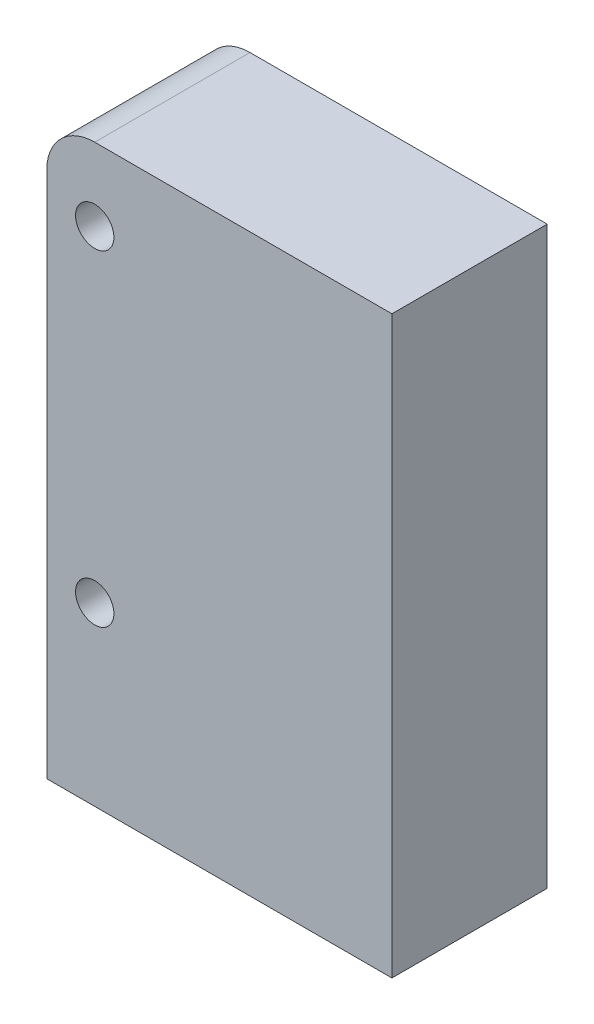
ISO-10303-21;
HEADER;
FILE_DESCRIPTION(('STEP AP214'),'2;1');
FILE_NAME('part.step','',(''),(''),'','','');
FILE_SCHEMA(('AUTOMOTIVE_DESIGN { 1 0 10303 214 1 1 1 1 }'));
ENDSEC;
DATA;
#1=APPLICATION_CONTEXT('core data for automotive mechanical design processes');
#2=APPLICATION_PROTOCOL_DEFINITION('international standard','automotive_design',2000,#1);
#3=PRODUCT_CONTEXT('',#1,'mechanical');
#4=PRODUCT('Part','Part','',(#3));
#5=PRODUCT_RELATED_PRODUCT_CATEGORY('part','',(#4));
#6=PRODUCT_DEFINITION_FORMATION('','',#4);
#7=PRODUCT_DEFINITION_CONTEXT('part definition',#1,'design');
#8=PRODUCT_DEFINITION('design','',#6,#7);
#9=PRODUCT_DEFINITION_SHAPE('','',#8);
#10=(LENGTH_UNIT() NAMED_UNIT(*) SI_UNIT(.MILLI.,.METRE.));
#11=(NAMED_UNIT(*) PLANE_ANGLE_UNIT() SI_UNIT($,.RADIAN.));
#12=(NAMED_UNIT(*) SI_UNIT($,.STERADIAN.) SOLID_ANGLE_UNIT());
#13=UNCERTAINTY_MEASURE_WITH_UNIT(LENGTH_MEASURE(1.E-05),#10,'distance_accuracy_value','');
#14=(GEOMETRIC_REPRESENTATION_CONTEXT(3) GLOBAL_UNCERTAINTY_ASSIGNED_CONTEXT((#13)) GLOBAL_UNIT_ASSIGNED_CONTEXT((#10,
#11,#12)) REPRESENTATION_CONTEXT('',''));
#15=CARTESIAN_POINT('',(0.,0.,0.));
#16=DIRECTION('',(0.,0.,1.));
#17=DIRECTION('',(1.,0.,0.));
#18=AXIS2_PLACEMENT_3D('',#15,#16,#17);
#19=CARTESIAN_POINT('',(0.,0.,8.1));
#20=DIRECTION('',(1.,0.,0.));
#21=DIRECTION('',(0.,0.,-1.));
#22=AXIS2_PLACEMENT_3D('',#19,#20,#21);
#23=PLANE('',#22);
#24=DIRECTION('',(0.,-1.,0.));
#25=VECTOR('',#24,1.);
#26=CARTESIAN_POINT('',(0.,0.,8.1));
#27=LINE('',#26,#25);
#28=CARTESIAN_POINT('',(0.,27.5,8.1));
#29=VERTEX_POINT('',#28);
#30=CARTESIAN_POINT('',(0.,0.,8.1));
#31=VERTEX_POINT('',#30);
#32=EDGE_CURVE('E79',#29,#31,#27,.T.);
#33=ORIENTED_EDGE('',*,*,#32,.F.);
#34=DIRECTION('',(0.,0.,-1.));
#35=VECTOR('',#34,1.);
#36=CARTESIAN_POINT('',(0.,27.5,8.1));
#37=LINE('',#36,#35);
#38=CARTESIAN_POINT('',(0.,27.5,0.));
#39=VERTEX_POINT('',#38);
#40=EDGE_CURVE('E102',#29,#39,#37,.T.);
#41=ORIENTED_EDGE('',*,*,#40,.T.);
#42=DIRECTION('',(0.,-1.,0.));
#43=VECTOR('',#42,1.);
#44=CARTESIAN_POINT('',(0.,0.,0.));
#45=LINE('',#44,#43);
#46=CARTESIAN_POINT('',(0.,0.,0.));
#47=VERTEX_POINT('',#46);
#48=EDGE_CURVE('E100',#39,#47,#45,.T.);
#49=ORIENTED_EDGE('',*,*,#48,.T.);
#50=DIRECTION('',(0.,0.,-1.));
#51=VECTOR('',#50,1.);
#52=CARTESIAN_POINT('',(0.,0.,8.1));
#53=LINE('',#52,#51);
#54=EDGE_CURVE('E94',#31,#47,#53,.T.);
#55=ORIENTED_EDGE('',*,*,#54,.F.);
#56=EDGE_LOOP('',(#33,#41,#49,#55));
#57=FACE_BOUND('',#56,.T.);
#58=ADVANCED_FACE('F33',(#57),#23,.F.);
#59=CARTESIAN_POINT('',(0.,0.,8.1));
#60=DIRECTION('',(0.,1.,0.));
#61=DIRECTION('',(0.,0.,1.));
#62=AXIS2_PLACEMENT_3D('',#59,#60,#61);
#63=PLANE('',#62);
#64=DIRECTION('',(1.,0.,0.));
#65=VECTOR('',#64,1.);
#66=CARTESIAN_POINT('',(0.,0.,0.));
#67=LINE('',#66,#65);
#68=CARTESIAN_POINT('',(18.,0.,0.));
#69=VERTEX_POINT('',#68);
#70=EDGE_CURVE('E115',#47,#69,#67,.T.);
#71=ORIENTED_EDGE('',*,*,#70,.T.);
#72=DIRECTION('',(0.,0.,-1.));
#73=VECTOR('',#72,1.);
#74=CARTESIAN_POINT('',(18.,0.,8.1));
#75=LINE('',#74,#73);
#76=CARTESIAN_POINT('',(18.,0.,8.1));
#77=VERTEX_POINT('',#76);
#78=EDGE_CURVE('E96',#77,#69,#75,.T.);
#79=ORIENTED_EDGE('',*,*,#78,.F.);
#80=DIRECTION('',(1.,0.,0.));
#81=VECTOR('',#80,1.);
#82=CARTESIAN_POINT('',(0.,0.,8.1));
#83=LINE('',#82,#81);
#84=EDGE_CURVE('E82',#31,#77,#83,.T.);
#85=ORIENTED_EDGE('',*,*,#84,.F.);
#86=ORIENTED_EDGE('',*,*,#54,.T.);
#87=EDGE_LOOP('',(#71,#79,#85,#86));
#88=FACE_BOUND('',#87,.T.);
#89=ADVANCED_FACE('F93',(#88),#63,.F.);
#90=CARTESIAN_POINT('',(18.,0.,8.1));
#91=DIRECTION('',(-1.,0.,0.));
#92=DIRECTION('',(0.,0.,1.));
#93=AXIS2_PLACEMENT_3D('',#90,#91,#92);
#94=PLANE('',#93);
#95=DIRECTION('',(0.,1.,0.));
#96=VECTOR('',#95,1.);
#97=CARTESIAN_POINT('',(18.,0.,0.));
#98=LINE('',#97,#96);
#99=CARTESIAN_POINT('',(18.,30.,0.));
#100=VERTEX_POINT('',#99);
#101=EDGE_CURVE('E113',#69,#100,#98,.T.);
#102=ORIENTED_EDGE('',*,*,#101,.T.);
#103=DIRECTION('',(0.,0.,-1.));
#104=VECTOR('',#103,1.);
#105=CARTESIAN_POINT('',(18.,30.,8.1));
#106=LINE('',#105,#104);
#107=CARTESIAN_POINT('',(18.,30.,8.1));
#108=VERTEX_POINT('',#107);
#109=EDGE_CURVE('E105',#108,#100,#106,.T.);
#110=ORIENTED_EDGE('',*,*,#109,.F.);
#111=DIRECTION('',(0.,1.,0.));
#112=VECTOR('',#111,1.);
#113=CARTESIAN_POINT('',(18.,0.,8.1));
#114=LINE('',#113,#112);
#115=EDGE_CURVE('E98',#77,#108,#114,.T.);
#116=ORIENTED_EDGE('',*,*,#115,.F.);
#117=ORIENTED_EDGE('',*,*,#78,.T.);
#118=EDGE_LOOP('',(#102,#110,#116,#117));
#119=FACE_BOUND('',#118,.T.);
#120=ADVANCED_FACE('F161',(#119),#94,.F.);
#121=CARTESIAN_POINT('',(0.,30.,8.1));
#122=DIRECTION('',(0.,-1.,0.));
#123=DIRECTION('',(0.,0.,-1.));
#124=AXIS2_PLACEMENT_3D('',#121,#122,#123);
#125=PLANE('',#124);
#126=DIRECTION('',(-1.,0.,0.));
#127=VECTOR('',#126,1.);
#128=CARTESIAN_POINT('',(0.,30.,0.));
#129=LINE('',#128,#127);
#130=CARTESIAN_POINT('',(2.5,30.,0.));
#131=VERTEX_POINT('',#130);
#132=EDGE_CURVE('E89',#100,#131,#129,.T.);
#133=ORIENTED_EDGE('',*,*,#132,.T.);
#134=DIRECTION('',(0.,0.,-1.));
#135=VECTOR('',#134,1.);
#136=CARTESIAN_POINT('',(2.5,30.,8.1));
#137=LINE('',#136,#135);
#138=CARTESIAN_POINT('',(2.5,30.,8.1));
#139=VERTEX_POINT('',#138);
#140=EDGE_CURVE('E41',#131,#139,#137,.F.);
#141=ORIENTED_EDGE('',*,*,#140,.T.);
#142=DIRECTION('',(-1.,0.,0.));
#143=VECTOR('',#142,1.);
#144=CARTESIAN_POINT('',(0.,30.,8.1));
#145=LINE('',#144,#143);
#146=EDGE_CURVE('E111',#108,#139,#145,.T.);
#147=ORIENTED_EDGE('',*,*,#146,.F.);
#148=ORIENTED_EDGE('',*,*,#109,.T.);
#149=EDGE_LOOP('',(#133,#141,#147,#148));
#150=FACE_BOUND('',#149,.T.);
#151=ADVANCED_FACE('F145',(#150),#125,.F.);
#152=CARTESIAN_POINT('',(0.,0.,8.1));
#153=DIRECTION('',(0.,0.,-1.));
#154=DIRECTION('',(-1.,0.,0.));
#155=AXIS2_PLACEMENT_3D('',#152,#153,#154);
#156=PLANE('',#155);
#157=CARTESIAN_POINT('',(2.5,9.2,8.1));
#158=DIRECTION('',(0.,0.,1.));
#159=DIRECTION('',(1.,0.,0.));
#160=AXIS2_PLACEMENT_3D('',#157,#158,#159);
#161=CIRCLE('',#160,1.);
#162=CARTESIAN_POINT('',(3.5,9.2,8.1));
#163=VERTEX_POINT('',#162);
#164=EDGE_CURVE('E127',#163,#163,#161,.T.);
#165=ORIENTED_EDGE('',*,*,#164,.F.);
#166=EDGE_LOOP('',(#165));
#167=FACE_BOUND('',#166,.T.);
#168=CARTESIAN_POINT('',(2.5,26.2,8.1));
#169=DIRECTION('',(0.,0.,1.));
#170=DIRECTION('',(1.,0.,0.));
#171=AXIS2_PLACEMENT_3D('',#168,#169,#170);
#172=CIRCLE('',#171,1.);
#173=CARTESIAN_POINT('',(3.5,26.2,8.1));
#174=VERTEX_POINT('',#173);
#175=EDGE_CURVE('E121',#174,#174,#172,.T.);
#176=ORIENTED_EDGE('',*,*,#175,.F.);
#177=EDGE_LOOP('',(#176));
#178=FACE_BOUND('',#177,.T.);
#179=ORIENTED_EDGE('',*,*,#146,.T.);
#180=CARTESIAN_POINT('',(2.5,27.5,8.1));
#181=DIRECTION('',(0.,0.,-1.));
#182=DIRECTION('',(-1.,0.,0.));
#183=AXIS2_PLACEMENT_3D('',#180,#181,#182);
#184=CIRCLE('',#183,2.5);
#185=EDGE_CURVE('E11',#139,#29,#184,.F.);
#186=ORIENTED_EDGE('',*,*,#185,.T.);
#187=ORIENTED_EDGE('',*,*,#32,.T.);
#188=ORIENTED_EDGE('',*,*,#84,.T.);
#189=ORIENTED_EDGE('',*,*,#115,.T.);
#190=EDGE_LOOP('',(#179,#186,#187,#188,#189));
#191=FACE_BOUND('',#190,.T.);
#192=ADVANCED_FACE('F81',(#167,#178,#191),#156,.F.);
#193=CARTESIAN_POINT('',(0.,0.,0.));
#194=DIRECTION('',(0.,0.,-1.));
#195=DIRECTION('',(-1.,0.,0.));
#196=AXIS2_PLACEMENT_3D('',#193,#194,#195);
#197=PLANE('',#196);
#198=CARTESIAN_POINT('',(2.5,9.2,0.));
#199=DIRECTION('',(0.,0.,1.));
#200=DIRECTION('',(1.,0.,0.));
#201=AXIS2_PLACEMENT_3D('',#198,#199,#200);
#202=CIRCLE('',#201,1.);
#203=CARTESIAN_POINT('',(3.5,9.2,0.));
#204=VERTEX_POINT('',#203);
#205=EDGE_CURVE('E124',#204,#204,#202,.T.);
#206=ORIENTED_EDGE('',*,*,#205,.T.);
#207=EDGE_LOOP('',(#206));
#208=FACE_BOUND('',#207,.T.);
#209=CARTESIAN_POINT('',(2.5,26.2,0.));
#210=DIRECTION('',(0.,0.,1.));
#211=DIRECTION('',(1.,0.,0.));
#212=AXIS2_PLACEMENT_3D('',#209,#210,#211);
#213=CIRCLE('',#212,1.);
#214=CARTESIAN_POINT('',(3.5,26.2,0.));
#215=VERTEX_POINT('',#214);
#216=EDGE_CURVE('E118',#215,#215,#213,.T.);
#217=ORIENTED_EDGE('',*,*,#216,.T.);
#218=EDGE_LOOP('',(#217));
#219=FACE_BOUND('',#218,.T.);
#220=ORIENTED_EDGE('',*,*,#48,.F.);
#221=CARTESIAN_POINT('',(2.5,27.5,0.));
#222=DIRECTION('',(0.,0.,-1.));
#223=DIRECTION('',(-1.,0.,0.));
#224=AXIS2_PLACEMENT_3D('',#221,#222,#223);
#225=CIRCLE('',#224,2.5);
#226=EDGE_CURVE('E55',#39,#131,#225,.T.);
#227=ORIENTED_EDGE('',*,*,#226,.T.);
#228=ORIENTED_EDGE('',*,*,#132,.F.);
#229=ORIENTED_EDGE('',*,*,#101,.F.);
#230=ORIENTED_EDGE('',*,*,#70,.F.);
#231=EDGE_LOOP('',(#220,#227,#228,#229,#230));
#232=FACE_BOUND('',#231,.T.);
#233=ADVANCED_FACE('F133',(#208,#219,#232),#197,.T.);
#234=CARTESIAN_POINT('',(2.5,26.2,0.));
#235=DIRECTION('',(0.,0.,1.));
#236=DIRECTION('',(1.,0.,0.));
#237=AXIS2_PLACEMENT_3D('',#234,#235,#236);
#238=CYLINDRICAL_SURFACE('',#237,1.);
#239=ORIENTED_EDGE('',*,*,#216,.F.);
#240=EDGE_LOOP('',(#239));
#241=FACE_BOUND('',#240,.T.);
#242=ORIENTED_EDGE('',*,*,#175,.T.);
#243=EDGE_LOOP('',(#242));
#244=FACE_BOUND('',#243,.T.);
#245=ADVANCED_FACE('F139',(#241,#244),#238,.F.);
#246=CARTESIAN_POINT('',(2.5,9.2,0.));
#247=DIRECTION('',(0.,0.,1.));
#248=DIRECTION('',(1.,0.,0.));
#249=AXIS2_PLACEMENT_3D('',#246,#247,#248);
#250=CYLINDRICAL_SURFACE('',#249,1.);
#251=ORIENTED_EDGE('',*,*,#205,.F.);
#252=EDGE_LOOP('',(#251));
#253=FACE_BOUND('',#252,.T.);
#254=ORIENTED_EDGE('',*,*,#164,.T.);
#255=EDGE_LOOP('',(#254));
#256=FACE_BOUND('',#255,.T.);
#257=ADVANCED_FACE('F136',(#253,#256),#250,.F.);
#258=CARTESIAN_POINT('',(2.5,27.5,8.1));
#259=DIRECTION('',(0.,0.,-1.));
#260=DIRECTION('',(-1.,0.,0.));
#261=AXIS2_PLACEMENT_3D('',#258,#259,#260);
#262=CYLINDRICAL_SURFACE('',#261,2.5);
#263=ORIENTED_EDGE('',*,*,#185,.F.);
#264=ORIENTED_EDGE('',*,*,#140,.F.);
#265=ORIENTED_EDGE('',*,*,#226,.F.);
#266=ORIENTED_EDGE('',*,*,#40,.F.);
#267=EDGE_LOOP('',(#263,#264,#265,#266));
#268=FACE_BOUND('',#267,.T.);
#269=ADVANCED_FACE('F35',(#268),#262,.T.);
#270=CLOSED_SHELL('',(#58,#89,#120,#151,#192,#233,#245,#257,#269));
#271=MANIFOLD_SOLID_BREP('B2',#270);
#272=ADVANCED_BREP_SHAPE_REPRESENTATION('',(#18,#271),#14);
#273=SHAPE_DEFINITION_REPRESENTATION(#9,#272);
ENDSEC;
END-ISO-10303-21;
